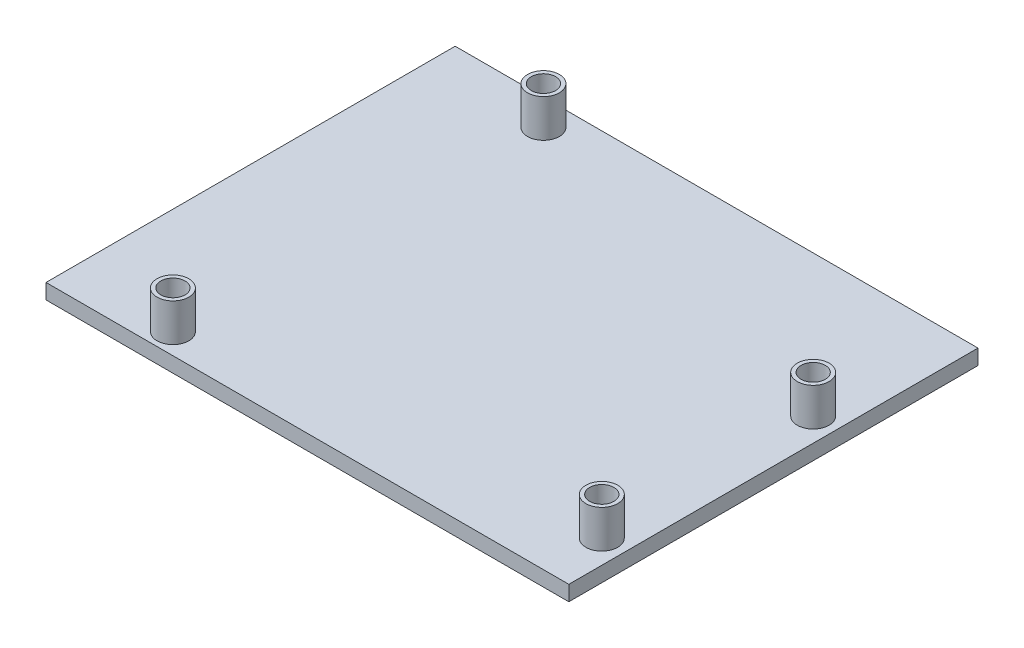
ISO-10303-21;
HEADER;
FILE_DESCRIPTION(('STEP AP214'),'2;1');
FILE_NAME('part.step','',(''),(''),'','','');
FILE_SCHEMA(('AUTOMOTIVE_DESIGN { 1 0 10303 214 1 1 1 1 }'));
ENDSEC;
DATA;
#1=APPLICATION_CONTEXT('core data for automotive mechanical design processes');
#2=APPLICATION_PROTOCOL_DEFINITION('international standard','automotive_design',2000,#1);
#3=PRODUCT_CONTEXT('',#1,'mechanical');
#4=PRODUCT('Part','Part','',(#3));
#5=PRODUCT_RELATED_PRODUCT_CATEGORY('part','',(#4));
#6=PRODUCT_DEFINITION_FORMATION('','',#4);
#7=PRODUCT_DEFINITION_CONTEXT('part definition',#1,'design');
#8=PRODUCT_DEFINITION('design','',#6,#7);
#9=PRODUCT_DEFINITION_SHAPE('','',#8);
#10=(LENGTH_UNIT() NAMED_UNIT(*) SI_UNIT(.MILLI.,.METRE.));
#11=(NAMED_UNIT(*) PLANE_ANGLE_UNIT() SI_UNIT($,.RADIAN.));
#12=(NAMED_UNIT(*) SI_UNIT($,.STERADIAN.) SOLID_ANGLE_UNIT());
#13=UNCERTAINTY_MEASURE_WITH_UNIT(LENGTH_MEASURE(1.E-05),#10,'distance_accuracy_value','');
#14=(GEOMETRIC_REPRESENTATION_CONTEXT(3) GLOBAL_UNCERTAINTY_ASSIGNED_CONTEXT((#13)) GLOBAL_UNIT_ASSIGNED_CONTEXT((#10,
#11,#12)) REPRESENTATION_CONTEXT('',''));
#15=CARTESIAN_POINT('',(0.,0.,0.));
#16=DIRECTION('',(0.,0.,1.));
#17=DIRECTION('',(1.,0.,0.));
#18=AXIS2_PLACEMENT_3D('',#15,#16,#17);
#19=CARTESIAN_POINT('',(34.5,2.,27.));
#20=DIRECTION('',(-1.,0.,0.));
#21=DIRECTION('',(0.,0.,1.));
#22=AXIS2_PLACEMENT_3D('',#19,#20,#21);
#23=PLANE('',#22);
#24=DIRECTION('',(0.,0.,-1.));
#25=VECTOR('',#24,1.);
#26=CARTESIAN_POINT('',(34.5,0.,27.));
#27=LINE('',#26,#25);
#28=CARTESIAN_POINT('',(34.5,0.,27.));
#29=VERTEX_POINT('',#28);
#30=CARTESIAN_POINT('',(34.5,0.,-27.));
#31=VERTEX_POINT('',#30);
#32=EDGE_CURVE('E111',#29,#31,#27,.T.);
#33=ORIENTED_EDGE('',*,*,#32,.T.);
#34=DIRECTION('',(0.,-1.,0.));
#35=VECTOR('',#34,1.);
#36=CARTESIAN_POINT('',(34.5,2.,-27.));
#37=LINE('',#36,#35);
#38=CARTESIAN_POINT('',(34.5,2.,-27.));
#39=VERTEX_POINT('',#38);
#40=EDGE_CURVE('E100',#39,#31,#37,.T.);
#41=ORIENTED_EDGE('',*,*,#40,.F.);
#42=DIRECTION('',(0.,0.,-1.));
#43=VECTOR('',#42,1.);
#44=CARTESIAN_POINT('',(34.5,2.,27.));
#45=LINE('',#44,#43);
#46=CARTESIAN_POINT('',(34.5,2.,27.));
#47=VERTEX_POINT('',#46);
#48=EDGE_CURVE('E92',#47,#39,#45,.T.);
#49=ORIENTED_EDGE('',*,*,#48,.F.);
#50=DIRECTION('',(0.,-1.,0.));
#51=VECTOR('',#50,1.);
#52=CARTESIAN_POINT('',(34.5,2.,27.));
#53=LINE('',#52,#51);
#54=EDGE_CURVE('E107',#47,#29,#53,.T.);
#55=ORIENTED_EDGE('',*,*,#54,.T.);
#56=EDGE_LOOP('',(#33,#41,#49,#55));
#57=FACE_BOUND('',#56,.T.);
#58=ADVANCED_FACE('F39',(#57),#23,.F.);
#59=CARTESIAN_POINT('',(-34.5,2.,-27.));
#60=DIRECTION('',(0.,0.,1.));
#61=DIRECTION('',(1.,0.,0.));
#62=AXIS2_PLACEMENT_3D('',#59,#60,#61);
#63=PLANE('',#62);
#64=DIRECTION('',(-1.,0.,0.));
#65=VECTOR('',#64,1.);
#66=CARTESIAN_POINT('',(-34.5,0.,-27.));
#67=LINE('',#66,#65);
#68=CARTESIAN_POINT('',(-34.5,0.,-27.));
#69=VERTEX_POINT('',#68);
#70=EDGE_CURVE('E98',#31,#69,#67,.T.);
#71=ORIENTED_EDGE('',*,*,#70,.T.);
#72=DIRECTION('',(0.,-1.,0.));
#73=VECTOR('',#72,1.);
#74=CARTESIAN_POINT('',(-34.5,2.,-27.));
#75=LINE('',#74,#73);
#76=CARTESIAN_POINT('',(-34.5,2.,-27.));
#77=VERTEX_POINT('',#76);
#78=EDGE_CURVE('E96',#77,#69,#75,.T.);
#79=ORIENTED_EDGE('',*,*,#78,.F.);
#80=DIRECTION('',(-1.,0.,0.));
#81=VECTOR('',#80,1.);
#82=CARTESIAN_POINT('',(-34.5,2.,-27.));
#83=LINE('',#82,#81);
#84=EDGE_CURVE('E87',#39,#77,#83,.T.);
#85=ORIENTED_EDGE('',*,*,#84,.F.);
#86=ORIENTED_EDGE('',*,*,#40,.T.);
#87=EDGE_LOOP('',(#71,#79,#85,#86));
#88=FACE_BOUND('',#87,.T.);
#89=ADVANCED_FACE('F97',(#88),#63,.F.);
#90=CARTESIAN_POINT('',(-34.5,2.,27.));
#91=DIRECTION('',(1.,0.,0.));
#92=DIRECTION('',(0.,0.,-1.));
#93=AXIS2_PLACEMENT_3D('',#90,#91,#92);
#94=PLANE('',#93);
#95=DIRECTION('',(0.,0.,1.));
#96=VECTOR('',#95,1.);
#97=CARTESIAN_POINT('',(-34.5,0.,27.));
#98=LINE('',#97,#96);
#99=CARTESIAN_POINT('',(-34.5,0.,27.));
#100=VERTEX_POINT('',#99);
#101=EDGE_CURVE('E73',#69,#100,#98,.T.);
#102=ORIENTED_EDGE('',*,*,#101,.T.);
#103=DIRECTION('',(0.,-1.,0.));
#104=VECTOR('',#103,1.);
#105=CARTESIAN_POINT('',(-34.5,2.,27.));
#106=LINE('',#105,#104);
#107=CARTESIAN_POINT('',(-34.5,2.,27.));
#108=VERTEX_POINT('',#107);
#109=EDGE_CURVE('E101',#108,#100,#106,.T.);
#110=ORIENTED_EDGE('',*,*,#109,.F.);
#111=DIRECTION('',(0.,0.,1.));
#112=VECTOR('',#111,1.);
#113=CARTESIAN_POINT('',(-34.5,2.,27.));
#114=LINE('',#113,#112);
#115=EDGE_CURVE('E90',#77,#108,#114,.T.);
#116=ORIENTED_EDGE('',*,*,#115,.F.);
#117=ORIENTED_EDGE('',*,*,#78,.T.);
#118=EDGE_LOOP('',(#102,#110,#116,#117));
#119=FACE_BOUND('',#118,.T.);
#120=ADVANCED_FACE('F103',(#119),#94,.F.);
#121=CARTESIAN_POINT('',(-34.5,2.,27.));
#122=DIRECTION('',(0.,0.,-1.));
#123=DIRECTION('',(-1.,0.,0.));
#124=AXIS2_PLACEMENT_3D('',#121,#122,#123);
#125=PLANE('',#124);
#126=DIRECTION('',(1.,0.,0.));
#127=VECTOR('',#126,1.);
#128=CARTESIAN_POINT('',(-34.5,0.,27.));
#129=LINE('',#128,#127);
#130=EDGE_CURVE('E79',#100,#29,#129,.T.);
#131=ORIENTED_EDGE('',*,*,#130,.T.);
#132=ORIENTED_EDGE('',*,*,#54,.F.);
#133=DIRECTION('',(1.,0.,0.));
#134=VECTOR('',#133,1.);
#135=CARTESIAN_POINT('',(-34.5,2.,27.));
#136=LINE('',#135,#134);
#137=EDGE_CURVE('E56',#108,#47,#136,.T.);
#138=ORIENTED_EDGE('',*,*,#137,.F.);
#139=ORIENTED_EDGE('',*,*,#109,.T.);
#140=EDGE_LOOP('',(#131,#132,#138,#139));
#141=FACE_BOUND('',#140,.T.);
#142=ADVANCED_FACE('F144',(#141),#125,.F.);
#143=CARTESIAN_POINT('',(0.,2.,0.));
#144=DIRECTION('',(0.,-1.,0.));
#145=DIRECTION('',(0.,0.,-1.));
#146=AXIS2_PLACEMENT_3D('',#143,#144,#145);
#147=PLANE('',#146);
#148=CARTESIAN_POINT('',(-20.5,2.,24.25));
#149=DIRECTION('',(0.,-1.,0.));
#150=DIRECTION('',(0.,0.,-1.));
#151=AXIS2_PLACEMENT_3D('',#148,#149,#150);
#152=CIRCLE('',#151,2.1);
#153=CARTESIAN_POINT('',(-20.5,2.,22.15));
#154=VERTEX_POINT('',#153);
#155=EDGE_CURVE('E11',#154,#154,#152,.F.);
#156=ORIENTED_EDGE('',*,*,#155,.F.);
#157=EDGE_LOOP('',(#156));
#158=FACE_BOUND('',#157,.T.);
#159=CARTESIAN_POINT('',(31.4,2.,19.55));
#160=DIRECTION('',(0.,-1.,0.));
#161=DIRECTION('',(0.,0.,-1.));
#162=AXIS2_PLACEMENT_3D('',#159,#160,#161);
#163=CIRCLE('',#162,2.1);
#164=CARTESIAN_POINT('',(31.4,2.,17.45));
#165=VERTEX_POINT('',#164);
#166=EDGE_CURVE('E48',#165,#165,#163,.F.);
#167=ORIENTED_EDGE('',*,*,#166,.F.);
#168=EDGE_LOOP('',(#167));
#169=FACE_BOUND('',#168,.T.);
#170=CARTESIAN_POINT('',(-19.4,2.,-23.55));
#171=DIRECTION('',(0.,-1.,0.));
#172=DIRECTION('',(0.,0.,-1.));
#173=AXIS2_PLACEMENT_3D('',#170,#171,#172);
#174=CIRCLE('',#173,2.1);
#175=CARTESIAN_POINT('',(-19.4,2.,-25.65));
#176=VERTEX_POINT('',#175);
#177=EDGE_CURVE('E132',#176,#176,#174,.F.);
#178=ORIENTED_EDGE('',*,*,#177,.F.);
#179=EDGE_LOOP('',(#178));
#180=FACE_BOUND('',#179,.T.);
#181=CARTESIAN_POINT('',(31.4,2.,-8.35));
#182=DIRECTION('',(0.,-1.,0.));
#183=DIRECTION('',(0.,0.,-1.));
#184=AXIS2_PLACEMENT_3D('',#181,#182,#183);
#185=CIRCLE('',#184,2.1);
#186=CARTESIAN_POINT('',(31.4,2.,-10.45));
#187=VERTEX_POINT('',#186);
#188=EDGE_CURVE('E128',#187,#187,#185,.F.);
#189=ORIENTED_EDGE('',*,*,#188,.F.);
#190=EDGE_LOOP('',(#189));
#191=FACE_BOUND('',#190,.T.);
#192=ORIENTED_EDGE('',*,*,#48,.T.);
#193=ORIENTED_EDGE('',*,*,#84,.T.);
#194=ORIENTED_EDGE('',*,*,#115,.T.);
#195=ORIENTED_EDGE('',*,*,#137,.T.);
#196=EDGE_LOOP('',(#192,#193,#194,#195));
#197=FACE_BOUND('',#196,.T.);
#198=ADVANCED_FACE('F88',(#158,#169,#180,#191,#197),#147,.F.);
#199=CARTESIAN_POINT('',(0.,0.,0.));
#200=DIRECTION('',(0.,-1.,0.));
#201=DIRECTION('',(0.,0.,-1.));
#202=AXIS2_PLACEMENT_3D('',#199,#200,#201);
#203=PLANE('',#202);
#204=ORIENTED_EDGE('',*,*,#32,.F.);
#205=ORIENTED_EDGE('',*,*,#130,.F.);
#206=ORIENTED_EDGE('',*,*,#101,.F.);
#207=ORIENTED_EDGE('',*,*,#70,.F.);
#208=EDGE_LOOP('',(#204,#205,#206,#207));
#209=FACE_BOUND('',#208,.T.);
#210=ADVANCED_FACE('F143',(#209),#203,.T.);
#211=CARTESIAN_POINT('',(31.4,7.,-8.35));
#212=DIRECTION('',(0.,1.,0.));
#213=DIRECTION('',(0.,0.,1.));
#214=AXIS2_PLACEMENT_3D('',#211,#212,#213);
#215=PLANE('',#214);
#216=CARTESIAN_POINT('',(31.4,7.,-8.35));
#217=DIRECTION('',(0.,1.,0.));
#218=DIRECTION('',(0.,0.,1.));
#219=AXIS2_PLACEMENT_3D('',#216,#217,#218);
#220=CIRCLE('',#219,2.1);
#221=CARTESIAN_POINT('',(31.4,7.,-6.25000000000001));
#222=VERTEX_POINT('',#221);
#223=EDGE_CURVE('E115',#222,#222,#220,.T.);
#224=ORIENTED_EDGE('',*,*,#223,.T.);
#225=EDGE_LOOP('',(#224));
#226=FACE_BOUND('',#225,.T.);
#227=CARTESIAN_POINT('',(31.4,7.,-8.35));
#228=DIRECTION('',(0.,1.,0.));
#229=DIRECTION('',(0.,0.,1.));
#230=AXIS2_PLACEMENT_3D('',#227,#228,#229);
#231=CIRCLE('',#230,1.6);
#232=CARTESIAN_POINT('',(31.4,7.,-6.75));
#233=VERTEX_POINT('',#232);
#234=EDGE_CURVE('E380',#233,#233,#231,.T.);
#235=ORIENTED_EDGE('',*,*,#234,.F.);
#236=EDGE_LOOP('',(#235));
#237=FACE_BOUND('',#236,.T.);
#238=ADVANCED_FACE('F156',(#226,#237),#215,.T.);
#239=CARTESIAN_POINT('',(31.4,7.,-8.35));
#240=DIRECTION('',(0.,-1.,0.));
#241=DIRECTION('',(0.,0.,-1.));
#242=AXIS2_PLACEMENT_3D('',#239,#240,#241);
#243=CYLINDRICAL_SURFACE('',#242,2.1);
#244=ORIENTED_EDGE('',*,*,#223,.F.);
#245=EDGE_LOOP('',(#244));
#246=FACE_BOUND('',#245,.T.);
#247=ORIENTED_EDGE('',*,*,#188,.T.);
#248=EDGE_LOOP('',(#247));
#249=FACE_BOUND('',#248,.T.);
#250=ADVANCED_FACE('F153',(#246,#249),#243,.T.);
#251=CARTESIAN_POINT('',(31.4,7.,-8.35));
#252=DIRECTION('',(0.,-1.,0.));
#253=DIRECTION('',(0.,0.,-1.));
#254=AXIS2_PLACEMENT_3D('',#251,#252,#253);
#255=CYLINDRICAL_SURFACE('',#254,1.6);
#256=ORIENTED_EDGE('',*,*,#234,.T.);
#257=EDGE_LOOP('',(#256));
#258=FACE_BOUND('',#257,.T.);
#259=CARTESIAN_POINT('',(31.4,2.,-8.35));
#260=DIRECTION('',(0.,1.,0.));
#261=DIRECTION('',(0.,0.,1.));
#262=AXIS2_PLACEMENT_3D('',#259,#260,#261);
#263=CIRCLE('',#262,1.6);
#264=CARTESIAN_POINT('',(31.4,2.,-6.75));
#265=VERTEX_POINT('',#264);
#266=EDGE_CURVE('E379',#265,#265,#263,.T.);
#267=ORIENTED_EDGE('',*,*,#266,.F.);
#268=EDGE_LOOP('',(#267));
#269=FACE_BOUND('',#268,.T.);
#270=ADVANCED_FACE('F155',(#258,#269),#255,.F.);
#271=ORIENTED_EDGE('',*,*,#266,.T.);
#272=EDGE_LOOP('',(#271));
#273=FACE_BOUND('',#272,.T.);
#274=ADVANCED_FACE('F148',(#273),#147,.F.);
#275=CARTESIAN_POINT('',(-19.4,7.,-23.55));
#276=DIRECTION('',(0.,1.,0.));
#277=DIRECTION('',(0.,0.,1.));
#278=AXIS2_PLACEMENT_3D('',#275,#276,#277);
#279=PLANE('',#278);
#280=CARTESIAN_POINT('',(-19.4,7.,-23.55));
#281=DIRECTION('',(0.,1.,0.));
#282=DIRECTION('',(0.,0.,1.));
#283=AXIS2_PLACEMENT_3D('',#280,#281,#282);
#284=CIRCLE('',#283,2.1);
#285=CARTESIAN_POINT('',(-19.4,7.,-21.45));
#286=VERTEX_POINT('',#285);
#287=EDGE_CURVE('E372',#286,#286,#284,.T.);
#288=ORIENTED_EDGE('',*,*,#287,.T.);
#289=EDGE_LOOP('',(#288));
#290=FACE_BOUND('',#289,.T.);
#291=CARTESIAN_POINT('',(-19.4,7.,-23.55));
#292=DIRECTION('',(0.,1.,0.));
#293=DIRECTION('',(0.,0.,1.));
#294=AXIS2_PLACEMENT_3D('',#291,#292,#293);
#295=CIRCLE('',#294,1.6);
#296=CARTESIAN_POINT('',(-19.4,7.,-21.95));
#297=VERTEX_POINT('',#296);
#298=EDGE_CURVE('E368',#297,#297,#295,.T.);
#299=ORIENTED_EDGE('',*,*,#298,.F.);
#300=EDGE_LOOP('',(#299));
#301=FACE_BOUND('',#300,.T.);
#302=ADVANCED_FACE('F224',(#290,#301),#279,.T.);
#303=CARTESIAN_POINT('',(-19.4,7.,-23.55));
#304=DIRECTION('',(0.,-1.,0.));
#305=DIRECTION('',(0.,0.,-1.));
#306=AXIS2_PLACEMENT_3D('',#303,#304,#305);
#307=CYLINDRICAL_SURFACE('',#306,2.1);
#308=ORIENTED_EDGE('',*,*,#287,.F.);
#309=EDGE_LOOP('',(#308));
#310=FACE_BOUND('',#309,.T.);
#311=ORIENTED_EDGE('',*,*,#177,.T.);
#312=EDGE_LOOP('',(#311));
#313=FACE_BOUND('',#312,.T.);
#314=ADVANCED_FACE('F234',(#310,#313),#307,.T.);
#315=CARTESIAN_POINT('',(-19.4,7.,-23.55));
#316=DIRECTION('',(0.,-1.,0.));
#317=DIRECTION('',(0.,0.,-1.));
#318=AXIS2_PLACEMENT_3D('',#315,#316,#317);
#319=CYLINDRICAL_SURFACE('',#318,1.6);
#320=ORIENTED_EDGE('',*,*,#298,.T.);
#321=EDGE_LOOP('',(#320));
#322=FACE_BOUND('',#321,.T.);
#323=CARTESIAN_POINT('',(-19.4,2.,-23.55));
#324=DIRECTION('',(0.,1.,0.));
#325=DIRECTION('',(0.,0.,1.));
#326=AXIS2_PLACEMENT_3D('',#323,#324,#325);
#327=CIRCLE('',#326,1.6);
#328=CARTESIAN_POINT('',(-19.4,2.,-21.95));
#329=VERTEX_POINT('',#328);
#330=EDGE_CURVE('E367',#329,#329,#327,.T.);
#331=ORIENTED_EDGE('',*,*,#330,.F.);
#332=EDGE_LOOP('',(#331));
#333=FACE_BOUND('',#332,.T.);
#334=ADVANCED_FACE('F244',(#322,#333),#319,.F.);
#335=ORIENTED_EDGE('',*,*,#330,.T.);
#336=EDGE_LOOP('',(#335));
#337=FACE_BOUND('',#336,.T.);
#338=ADVANCED_FACE('F226',(#337),#147,.F.);
#339=CARTESIAN_POINT('',(31.4,7.,19.55));
#340=DIRECTION('',(0.,1.,0.));
#341=DIRECTION('',(0.,0.,1.));
#342=AXIS2_PLACEMENT_3D('',#339,#340,#341);
#343=PLANE('',#342);
#344=CARTESIAN_POINT('',(31.4,7.,19.55));
#345=DIRECTION('',(0.,1.,0.));
#346=DIRECTION('',(0.,0.,1.));
#347=AXIS2_PLACEMENT_3D('',#344,#345,#346);
#348=CIRCLE('',#347,2.1);
#349=CARTESIAN_POINT('',(31.4,7.,21.65));
#350=VERTEX_POINT('',#349);
#351=EDGE_CURVE('E360',#350,#350,#348,.T.);
#352=ORIENTED_EDGE('',*,*,#351,.T.);
#353=EDGE_LOOP('',(#352));
#354=FACE_BOUND('',#353,.T.);
#355=CARTESIAN_POINT('',(31.4,7.,19.55));
#356=DIRECTION('',(0.,1.,0.));
#357=DIRECTION('',(0.,0.,1.));
#358=AXIS2_PLACEMENT_3D('',#355,#356,#357);
#359=CIRCLE('',#358,1.6);
#360=CARTESIAN_POINT('',(31.4,7.,21.15));
#361=VERTEX_POINT('',#360);
#362=EDGE_CURVE('E356',#361,#361,#359,.T.);
#363=ORIENTED_EDGE('',*,*,#362,.F.);
#364=EDGE_LOOP('',(#363));
#365=FACE_BOUND('',#364,.T.);
#366=ADVANCED_FACE('F263',(#354,#365),#343,.T.);
#367=CARTESIAN_POINT('',(31.4,7.,19.55));
#368=DIRECTION('',(0.,-1.,0.));
#369=DIRECTION('',(0.,0.,-1.));
#370=AXIS2_PLACEMENT_3D('',#367,#368,#369);
#371=CYLINDRICAL_SURFACE('',#370,2.1);
#372=ORIENTED_EDGE('',*,*,#351,.F.);
#373=EDGE_LOOP('',(#372));
#374=FACE_BOUND('',#373,.T.);
#375=ORIENTED_EDGE('',*,*,#166,.T.);
#376=EDGE_LOOP('',(#375));
#377=FACE_BOUND('',#376,.T.);
#378=ADVANCED_FACE('F139',(#374,#377),#371,.T.);
#379=CARTESIAN_POINT('',(31.4,7.,19.55));
#380=DIRECTION('',(0.,-1.,0.));
#381=DIRECTION('',(0.,0.,-1.));
#382=AXIS2_PLACEMENT_3D('',#379,#380,#381);
#383=CYLINDRICAL_SURFACE('',#382,1.6);
#384=ORIENTED_EDGE('',*,*,#362,.T.);
#385=EDGE_LOOP('',(#384));
#386=FACE_BOUND('',#385,.T.);
#387=CARTESIAN_POINT('',(31.4,2.,19.55));
#388=DIRECTION('',(0.,1.,0.));
#389=DIRECTION('',(0.,0.,1.));
#390=AXIS2_PLACEMENT_3D('',#387,#388,#389);
#391=CIRCLE('',#390,1.6);
#392=CARTESIAN_POINT('',(31.4,2.,21.15));
#393=VERTEX_POINT('',#392);
#394=EDGE_CURVE('E355',#393,#393,#391,.T.);
#395=ORIENTED_EDGE('',*,*,#394,.F.);
#396=EDGE_LOOP('',(#395));
#397=FACE_BOUND('',#396,.T.);
#398=ADVANCED_FACE('F282',(#386,#397),#383,.F.);
#399=ORIENTED_EDGE('',*,*,#394,.T.);
#400=EDGE_LOOP('',(#399));
#401=FACE_BOUND('',#400,.T.);
#402=ADVANCED_FACE('F265',(#401),#147,.F.);
#403=CARTESIAN_POINT('',(-20.5,7.,24.25));
#404=DIRECTION('',(0.,1.,0.));
#405=DIRECTION('',(0.,0.,1.));
#406=AXIS2_PLACEMENT_3D('',#403,#404,#405);
#407=PLANE('',#406);
#408=CARTESIAN_POINT('',(-20.5,7.,24.25));
#409=DIRECTION('',(0.,1.,0.));
#410=DIRECTION('',(0.,0.,1.));
#411=AXIS2_PLACEMENT_3D('',#408,#409,#410);
#412=CIRCLE('',#411,2.1);
#413=CARTESIAN_POINT('',(-20.5,7.,26.35));
#414=VERTEX_POINT('',#413);
#415=EDGE_CURVE('E349',#414,#414,#412,.T.);
#416=ORIENTED_EDGE('',*,*,#415,.T.);
#417=EDGE_LOOP('',(#416));
#418=FACE_BOUND('',#417,.T.);
#419=CARTESIAN_POINT('',(-20.5,7.,24.25));
#420=DIRECTION('',(0.,1.,0.));
#421=DIRECTION('',(0.,0.,1.));
#422=AXIS2_PLACEMENT_3D('',#419,#420,#421);
#423=CIRCLE('',#422,1.6);
#424=CARTESIAN_POINT('',(-20.5,7.,25.85));
#425=VERTEX_POINT('',#424);
#426=EDGE_CURVE('E345',#425,#425,#423,.T.);
#427=ORIENTED_EDGE('',*,*,#426,.F.);
#428=EDGE_LOOP('',(#427));
#429=FACE_BOUND('',#428,.T.);
#430=ADVANCED_FACE('F301',(#418,#429),#407,.T.);
#431=CARTESIAN_POINT('',(-20.5,7.,24.25));
#432=DIRECTION('',(0.,-1.,0.));
#433=DIRECTION('',(0.,0.,-1.));
#434=AXIS2_PLACEMENT_3D('',#431,#432,#433);
#435=CYLINDRICAL_SURFACE('',#434,2.1);
#436=ORIENTED_EDGE('',*,*,#415,.F.);
#437=EDGE_LOOP('',(#436));
#438=FACE_BOUND('',#437,.T.);
#439=ORIENTED_EDGE('',*,*,#155,.T.);
#440=EDGE_LOOP('',(#439));
#441=FACE_BOUND('',#440,.T.);
#442=ADVANCED_FACE('F309',(#438,#441),#435,.T.);
#443=CARTESIAN_POINT('',(-20.5,7.,24.25));
#444=DIRECTION('',(0.,-1.,0.));
#445=DIRECTION('',(0.,0.,-1.));
#446=AXIS2_PLACEMENT_3D('',#443,#444,#445);
#447=CYLINDRICAL_SURFACE('',#446,1.6);
#448=ORIENTED_EDGE('',*,*,#426,.T.);
#449=EDGE_LOOP('',(#448));
#450=FACE_BOUND('',#449,.T.);
#451=CARTESIAN_POINT('',(-20.5,2.,24.25));
#452=DIRECTION('',(0.,1.,0.));
#453=DIRECTION('',(0.,0.,1.));
#454=AXIS2_PLACEMENT_3D('',#451,#452,#453);
#455=CIRCLE('',#454,1.6);
#456=CARTESIAN_POINT('',(-20.5,2.,25.85));
#457=VERTEX_POINT('',#456);
#458=EDGE_CURVE('E342',#457,#457,#455,.T.);
#459=ORIENTED_EDGE('',*,*,#458,.F.);
#460=EDGE_LOOP('',(#459));
#461=FACE_BOUND('',#460,.T.);
#462=ADVANCED_FACE('F319',(#450,#461),#447,.F.);
#463=ORIENTED_EDGE('',*,*,#458,.T.);
#464=EDGE_LOOP('',(#463));
#465=FACE_BOUND('',#464,.T.);
#466=ADVANCED_FACE('F147',(#465),#147,.F.);
#467=CLOSED_SHELL('',(#58,#89,#120,#142,#198,#210,#238,#250,#270,#274,#302,#314,#334,#338,#366,
#378,#398,#402,#430,#442,#462,#466));
#468=MANIFOLD_SOLID_BREP('B2',#467);
#469=ADVANCED_BREP_SHAPE_REPRESENTATION('',(#18,#468),#14);
#470=SHAPE_DEFINITION_REPRESENTATION(#9,#469);
ENDSEC;
END-ISO-10303-21;
